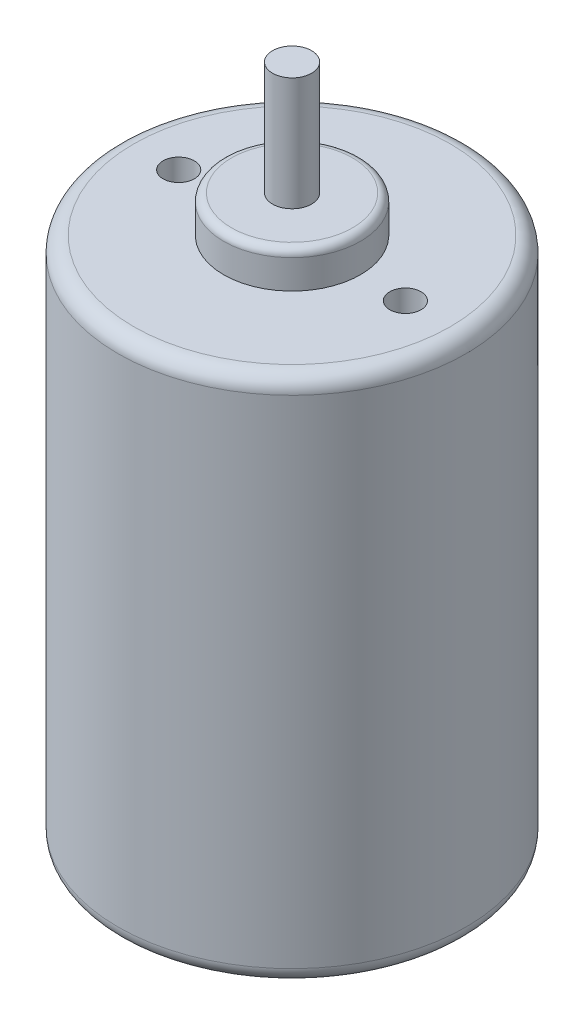
ISO-10303-21;
HEADER;
FILE_DESCRIPTION(('STEP AP214'),'2;1');
FILE_NAME('part.step','',(''),(''),'','','');
FILE_SCHEMA(('AUTOMOTIVE_DESIGN { 1 0 10303 214 1 1 1 1 }'));
ENDSEC;
DATA;
#1=APPLICATION_CONTEXT('core data for automotive mechanical design processes');
#2=APPLICATION_PROTOCOL_DEFINITION('international standard','automotive_design',2000,#1);
#3=PRODUCT_CONTEXT('',#1,'mechanical');
#4=PRODUCT('Part','Part','',(#3));
#5=PRODUCT_RELATED_PRODUCT_CATEGORY('part','',(#4));
#6=PRODUCT_DEFINITION_FORMATION('','',#4);
#7=PRODUCT_DEFINITION_CONTEXT('part definition',#1,'design');
#8=PRODUCT_DEFINITION('design','',#6,#7);
#9=PRODUCT_DEFINITION_SHAPE('','',#8);
#10=(LENGTH_UNIT() NAMED_UNIT(*) SI_UNIT(.MILLI.,.METRE.));
#11=(NAMED_UNIT(*) PLANE_ANGLE_UNIT() SI_UNIT($,.RADIAN.));
#12=(NAMED_UNIT(*) SI_UNIT($,.STERADIAN.) SOLID_ANGLE_UNIT());
#13=UNCERTAINTY_MEASURE_WITH_UNIT(LENGTH_MEASURE(1.E-05),#10,'distance_accuracy_value','');
#14=(GEOMETRIC_REPRESENTATION_CONTEXT(3) GLOBAL_UNCERTAINTY_ASSIGNED_CONTEXT((#13)) GLOBAL_UNIT_ASSIGNED_CONTEXT((#10,
#11,#12)) REPRESENTATION_CONTEXT('',''));
#15=CARTESIAN_POINT('',(0.,0.,0.));
#16=DIRECTION('',(0.,0.,1.));
#17=DIRECTION('',(1.,0.,0.));
#18=AXIS2_PLACEMENT_3D('',#15,#16,#17);
#19=CARTESIAN_POINT('',(0.,67.5,0.));
#20=DIRECTION('',(0.,-1.,0.));
#21=DIRECTION('',(0.,0.,-1.));
#22=AXIS2_PLACEMENT_3D('',#19,#20,#21);
#23=CYLINDRICAL_SURFACE('',#22,22.25);
#24=CARTESIAN_POINT('',(0.,2.,0.));
#25=DIRECTION('',(0.,1.,0.));
#26=DIRECTION('',(0.,0.,1.));
#27=AXIS2_PLACEMENT_3D('',#24,#25,#26);
#28=CIRCLE('',#27,22.25);
#29=CARTESIAN_POINT('',(0.,2.,22.25));
#30=VERTEX_POINT('',#29);
#31=EDGE_CURVE('E64',#30,#30,#28,.T.);
#32=ORIENTED_EDGE('',*,*,#31,.T.);
#33=EDGE_LOOP('',(#32));
#34=FACE_BOUND('',#33,.T.);
#35=CARTESIAN_POINT('',(0.,65.5,0.));
#36=DIRECTION('',(0.,1.,0.));
#37=DIRECTION('',(0.,0.,1.));
#38=AXIS2_PLACEMENT_3D('',#35,#36,#37);
#39=CIRCLE('',#38,22.25);
#40=CARTESIAN_POINT('',(0.,65.5,22.25));
#41=VERTEX_POINT('',#40);
#42=EDGE_CURVE('E68',#41,#41,#39,.F.);
#43=ORIENTED_EDGE('',*,*,#42,.T.);
#44=EDGE_LOOP('',(#43));
#45=FACE_BOUND('',#44,.T.);
#46=ADVANCED_FACE('F40',(#34,#45),#23,.T.);
#47=CARTESIAN_POINT('',(0.,67.5,0.));
#48=DIRECTION('',(0.,1.,0.));
#49=DIRECTION('',(0.,0.,1.));
#50=AXIS2_PLACEMENT_3D('',#47,#48,#49);
#51=PLANE('',#50);
#52=CARTESIAN_POINT('',(0.,67.5,0.));
#53=DIRECTION('',(0.,1.,0.));
#54=DIRECTION('',(0.,0.,1.));
#55=AXIS2_PLACEMENT_3D('',#52,#53,#54);
#56=CIRCLE('',#55,20.25);
#57=CARTESIAN_POINT('',(0.,67.5,20.25));
#58=VERTEX_POINT('',#57);
#59=EDGE_CURVE('E53',#58,#58,#56,.T.);
#60=ORIENTED_EDGE('',*,*,#59,.T.);
#61=EDGE_LOOP('',(#60));
#62=FACE_BOUND('',#61,.T.);
#63=CARTESIAN_POINT('',(14.5,67.5,0.));
#64=DIRECTION('',(0.,1.,0.));
#65=DIRECTION('',(0.,0.,1.));
#66=AXIS2_PLACEMENT_3D('',#63,#64,#65);
#67=CIRCLE('',#66,2.);
#68=CARTESIAN_POINT('',(14.5,67.5,2.));
#69=VERTEX_POINT('',#68);
#70=EDGE_CURVE('E93',#69,#69,#67,.T.);
#71=ORIENTED_EDGE('',*,*,#70,.F.);
#72=EDGE_LOOP('',(#71));
#73=FACE_BOUND('',#72,.T.);
#74=CARTESIAN_POINT('',(-14.5,67.5,0.));
#75=DIRECTION('',(0.,1.,0.));
#76=DIRECTION('',(0.,0.,1.));
#77=AXIS2_PLACEMENT_3D('',#74,#75,#76);
#78=CIRCLE('',#77,2.);
#79=CARTESIAN_POINT('',(-14.5,67.5,2.));
#80=VERTEX_POINT('',#79);
#81=EDGE_CURVE('E89',#80,#80,#78,.T.);
#82=ORIENTED_EDGE('',*,*,#81,.F.);
#83=EDGE_LOOP('',(#82));
#84=FACE_BOUND('',#83,.T.);
#85=CARTESIAN_POINT('',(0.,67.5,0.));
#86=DIRECTION('',(0.,1.,0.));
#87=DIRECTION('',(0.,0.,1.));
#88=AXIS2_PLACEMENT_3D('',#85,#86,#87);
#89=CIRCLE('',#88,8.75);
#90=CARTESIAN_POINT('',(0.,67.5,8.75));
#91=VERTEX_POINT('',#90);
#92=EDGE_CURVE('E73',#91,#91,#89,.T.);
#93=ORIENTED_EDGE('',*,*,#92,.F.);
#94=EDGE_LOOP('',(#93));
#95=FACE_BOUND('',#94,.T.);
#96=ADVANCED_FACE('F110',(#62,#73,#84,#95),#51,.T.);
#97=CARTESIAN_POINT('',(0.,0.,0.));
#98=DIRECTION('',(0.,1.,0.));
#99=DIRECTION('',(0.,0.,1.));
#100=AXIS2_PLACEMENT_3D('',#97,#98,#99);
#101=PLANE('',#100);
#102=CARTESIAN_POINT('',(0.,0.,0.));
#103=DIRECTION('',(0.,1.,0.));
#104=DIRECTION('',(0.,0.,1.));
#105=AXIS2_PLACEMENT_3D('',#102,#103,#104);
#106=CIRCLE('',#105,20.25);
#107=CARTESIAN_POINT('',(0.,0.,20.25));
#108=VERTEX_POINT('',#107);
#109=EDGE_CURVE('E58',#108,#108,#106,.F.);
#110=ORIENTED_EDGE('',*,*,#109,.T.);
#111=EDGE_LOOP('',(#110));
#112=FACE_BOUND('',#111,.T.);
#113=ADVANCED_FACE('F113',(#112),#101,.F.);
#114=CARTESIAN_POINT('',(0.,72.2,0.));
#115=DIRECTION('',(0.,-1.,0.));
#116=DIRECTION('',(0.,0.,-1.));
#117=AXIS2_PLACEMENT_3D('',#114,#115,#116);
#118=CYLINDRICAL_SURFACE('',#117,8.75);
#119=CARTESIAN_POINT('',(0.,71.2,0.));
#120=DIRECTION('',(0.,1.,0.));
#121=DIRECTION('',(0.,0.,1.));
#122=AXIS2_PLACEMENT_3D('',#119,#120,#121);
#123=CIRCLE('',#122,8.75);
#124=CARTESIAN_POINT('',(0.,71.2,8.75));
#125=VERTEX_POINT('',#124);
#126=EDGE_CURVE('E10',#125,#125,#123,.F.);
#127=ORIENTED_EDGE('',*,*,#126,.T.);
#128=EDGE_LOOP('',(#127));
#129=FACE_BOUND('',#128,.T.);
#130=ORIENTED_EDGE('',*,*,#92,.T.);
#131=EDGE_LOOP('',(#130));
#132=FACE_BOUND('',#131,.T.);
#133=ADVANCED_FACE('F120',(#129,#132),#118,.T.);
#134=CARTESIAN_POINT('',(0.,72.2,0.));
#135=DIRECTION('',(0.,1.,0.));
#136=DIRECTION('',(0.,0.,1.));
#137=AXIS2_PLACEMENT_3D('',#134,#135,#136);
#138=PLANE('',#137);
#139=CARTESIAN_POINT('',(0.,72.2,0.));
#140=DIRECTION('',(0.,1.,0.));
#141=DIRECTION('',(0.,0.,1.));
#142=AXIS2_PLACEMENT_3D('',#139,#140,#141);
#143=CIRCLE('',#142,7.75);
#144=CARTESIAN_POINT('',(0.,72.2,7.75));
#145=VERTEX_POINT('',#144);
#146=EDGE_CURVE('E48',#145,#145,#143,.T.);
#147=ORIENTED_EDGE('',*,*,#146,.T.);
#148=EDGE_LOOP('',(#147));
#149=FACE_BOUND('',#148,.T.);
#150=CARTESIAN_POINT('',(0.,72.2,0.));
#151=DIRECTION('',(0.,1.,0.));
#152=DIRECTION('',(0.,0.,1.));
#153=AXIS2_PLACEMENT_3D('',#150,#151,#152);
#154=CIRCLE('',#153,2.5);
#155=CARTESIAN_POINT('',(0.,72.2,-2.5));
#156=VERTEX_POINT('',#155);
#157=EDGE_CURVE('E72',#156,#156,#154,.T.);
#158=ORIENTED_EDGE('',*,*,#157,.F.);
#159=EDGE_LOOP('',(#158));
#160=FACE_BOUND('',#159,.T.);
#161=ADVANCED_FACE('F122',(#149,#160),#138,.T.);
#162=CARTESIAN_POINT('',(0.,86.7,0.));
#163=DIRECTION('',(0.,-1.,0.));
#164=DIRECTION('',(0.,0.,-1.));
#165=AXIS2_PLACEMENT_3D('',#162,#163,#164);
#166=CYLINDRICAL_SURFACE('',#165,2.5);
#167=CARTESIAN_POINT('',(0.,86.7,0.));
#168=DIRECTION('',(0.,1.,0.));
#169=DIRECTION('',(0.,0.,1.));
#170=AXIS2_PLACEMENT_3D('',#167,#168,#169);
#171=CIRCLE('',#170,2.5);
#172=CARTESIAN_POINT('',(0.,86.7,-2.5));
#173=VERTEX_POINT('',#172);
#174=EDGE_CURVE('E77',#173,#173,#171,.T.);
#175=CARTESIAN_POINT('',(0.,86.7,-2.5));
#176=CARTESIAN_POINT('',(0.,86.5489583333333,-2.5));
#177=CARTESIAN_POINT('',(0.,86.3979166666667,-2.5));
#178=CARTESIAN_POINT('',(0.,86.0958333333333,-2.5));
#179=CARTESIAN_POINT('',(0.,85.9447916666667,-2.5));
#180=CARTESIAN_POINT('',(0.,85.6427083333333,-2.5));
#181=CARTESIAN_POINT('',(0.,85.4916666666667,-2.5));
#182=CARTESIAN_POINT('',(0.,85.1895833333333,-2.5));
#183=CARTESIAN_POINT('',(0.,85.0385416666667,-2.5));
#184=CARTESIAN_POINT('',(0.,84.7364583333333,-2.5));
#185=CARTESIAN_POINT('',(0.,84.5854166666667,-2.5));
#186=CARTESIAN_POINT('',(0.,84.2833333333333,-2.5));
#187=CARTESIAN_POINT('',(0.,84.1322916666667,-2.5));
#188=CARTESIAN_POINT('',(0.,83.8302083333333,-2.5));
#189=CARTESIAN_POINT('',(0.,83.6791666666667,-2.5));
#190=CARTESIAN_POINT('',(0.,83.3770833333333,-2.5));
#191=CARTESIAN_POINT('',(0.,83.2260416666667,-2.5));
#192=CARTESIAN_POINT('',(0.,82.9239583333333,-2.5));
#193=CARTESIAN_POINT('',(0.,82.7729166666667,-2.5));
#194=CARTESIAN_POINT('',(0.,82.4708333333333,-2.5));
#195=CARTESIAN_POINT('',(0.,82.3197916666667,-2.5));
#196=CARTESIAN_POINT('',(0.,82.0177083333333,-2.5));
#197=CARTESIAN_POINT('',(0.,81.8666666666667,-2.5));
#198=CARTESIAN_POINT('',(0.,81.5645833333333,-2.5));
#199=CARTESIAN_POINT('',(0.,81.4135416666667,-2.5));
#200=CARTESIAN_POINT('',(0.,81.1114583333333,-2.5));
#201=CARTESIAN_POINT('',(0.,80.9604166666667,-2.5));
#202=CARTESIAN_POINT('',(0.,80.6583333333333,-2.5));
#203=CARTESIAN_POINT('',(0.,80.5072916666667,-2.5));
#204=CARTESIAN_POINT('',(0.,80.2052083333333,-2.5));
#205=CARTESIAN_POINT('',(0.,80.0541666666667,-2.5));
#206=CARTESIAN_POINT('',(0.,79.7520833333333,-2.5));
#207=CARTESIAN_POINT('',(0.,79.6010416666667,-2.5));
#208=CARTESIAN_POINT('',(0.,79.2989583333333,-2.5));
#209=CARTESIAN_POINT('',(0.,79.1479166666667,-2.5));
#210=CARTESIAN_POINT('',(0.,78.8458333333333,-2.5));
#211=CARTESIAN_POINT('',(0.,78.6947916666667,-2.5));
#212=CARTESIAN_POINT('',(0.,78.3927083333333,-2.5));
#213=CARTESIAN_POINT('',(0.,78.2416666666667,-2.5));
#214=CARTESIAN_POINT('',(0.,77.9395833333333,-2.5));
#215=CARTESIAN_POINT('',(0.,77.7885416666667,-2.5));
#216=CARTESIAN_POINT('',(0.,77.4864583333333,-2.5));
#217=CARTESIAN_POINT('',(0.,77.3354166666667,-2.5));
#218=CARTESIAN_POINT('',(0.,77.0333333333333,-2.5));
#219=CARTESIAN_POINT('',(0.,76.8822916666667,-2.5));
#220=CARTESIAN_POINT('',(0.,76.5802083333333,-2.5));
#221=CARTESIAN_POINT('',(0.,76.4291666666667,-2.5));
#222=CARTESIAN_POINT('',(0.,76.1270833333333,-2.5));
#223=CARTESIAN_POINT('',(0.,75.9760416666667,-2.5));
#224=CARTESIAN_POINT('',(0.,75.6739583333333,-2.5));
#225=CARTESIAN_POINT('',(0.,75.5229166666667,-2.5));
#226=CARTESIAN_POINT('',(0.,75.2208333333333,-2.5));
#227=CARTESIAN_POINT('',(0.,75.0697916666667,-2.5));
#228=CARTESIAN_POINT('',(0.,74.7677083333333,-2.5));
#229=CARTESIAN_POINT('',(0.,74.6166666666667,-2.5));
#230=CARTESIAN_POINT('',(0.,74.3145833333333,-2.5));
#231=CARTESIAN_POINT('',(0.,74.1635416666667,-2.5));
#232=CARTESIAN_POINT('',(0.,73.8614583333333,-2.5));
#233=CARTESIAN_POINT('',(0.,73.7104166666667,-2.5));
#234=CARTESIAN_POINT('',(0.,73.4083333333333,-2.5));
#235=CARTESIAN_POINT('',(0.,73.2572916666667,-2.5));
#236=CARTESIAN_POINT('',(0.,72.9552083333333,-2.5));
#237=CARTESIAN_POINT('',(0.,72.8041666666667,-2.5));
#238=CARTESIAN_POINT('',(0.,72.5020833333333,-2.5));
#239=CARTESIAN_POINT('',(0.,72.3510416666667,-2.5));
#240=CARTESIAN_POINT('',(0.,72.2,-2.5));
#241=B_SPLINE_CURVE_WITH_KNOTS('',3,(#175,#176,#177,#178,#179,#180,#181,#182,#183,#184,#185,
#186,#187,#188,#189,#190,#191,#192,#193,#194,#195,#196,#197,#198,#199,#200,#201,#202,#203,#204,
#205,#206,#207,#208,#209,#210,#211,#212,#213,#214,#215,#216,#217,#218,#219,#220,#221,#222,#223,
#224,#225,#226,#227,#228,#229,#230,#231,#232,#233,#234,#235,#236,#237,#238,#239,#240),
.UNSPECIFIED.,.F.,.F.,(4,2,2,2,2,2,2,2,2,2,2,2,2,2,2,2,2,2,2,2,2,2,2,2,2,2,2,2,2,2,2,2,4),(0.,
0.453125000000013,0.906250000000011,1.35937500000001,1.81250000000001,2.26562500000001,
2.71875000000001,3.171875,3.625,4.078125,4.53125,4.984375,5.43750000000001,5.89062500000001,
6.34375000000001,6.79687500000001,7.25000000000001,7.70312500000001,8.15625,8.609375,9.0625,
9.515625,9.96875,10.421875,10.875,11.328125,11.78125,12.234375,12.6875,13.140625,13.59375,
14.046875,14.5),.UNSPECIFIED.);
#242=EDGE_CURVE('BSEAM128',#173,#156,#241,.T.);
#243=ORIENTED_EDGE('',*,*,#174,.F.);
#244=ORIENTED_EDGE('',*,*,#157,.T.);
#245=ORIENTED_EDGE('',*,*,#242,.T.);
#246=ORIENTED_EDGE('',*,*,#242,.F.);
#247=EDGE_LOOP('',(#243,#245,#244,#246));
#248=FACE_BOUND('',#247,.T.);
#249=ADVANCED_FACE('F128',(#248),#166,.T.);
#250=CARTESIAN_POINT('',(0.,86.7,0.));
#251=DIRECTION('',(0.,1.,0.));
#252=DIRECTION('',(0.,0.,1.));
#253=AXIS2_PLACEMENT_3D('',#250,#251,#252);
#254=PLANE('',#253);
#255=ORIENTED_EDGE('',*,*,#174,.T.);
#256=EDGE_LOOP('',(#255));
#257=FACE_BOUND('',#256,.T.);
#258=ADVANCED_FACE('F237',(#257),#254,.T.);
#259=CARTESIAN_POINT('',(-14.5,53.,0.));
#260=DIRECTION('',(0.,1.,0.));
#261=DIRECTION('',(0.,0.,1.));
#262=AXIS2_PLACEMENT_3D('',#259,#260,#261);
#263=CYLINDRICAL_SURFACE('',#262,2.);
#264=CARTESIAN_POINT('',(-14.5,53.,0.));
#265=DIRECTION('',(0.,1.,0.));
#266=DIRECTION('',(0.,0.,1.));
#267=AXIS2_PLACEMENT_3D('',#264,#265,#266);
#268=CIRCLE('',#267,2.);
#269=CARTESIAN_POINT('',(-14.5,53.,2.));
#270=VERTEX_POINT('',#269);
#271=EDGE_CURVE('E85',#270,#270,#268,.T.);
#272=CARTESIAN_POINT('',(-14.5,53.,2.));
#273=CARTESIAN_POINT('',(-14.5,53.1510416666667,2.));
#274=CARTESIAN_POINT('',(-14.5,53.3020833333333,2.));
#275=CARTESIAN_POINT('',(-14.5,53.6041666666667,2.));
#276=CARTESIAN_POINT('',(-14.5,53.7552083333333,2.));
#277=CARTESIAN_POINT('',(-14.5,54.0572916666667,2.));
#278=CARTESIAN_POINT('',(-14.5,54.2083333333333,2.));
#279=CARTESIAN_POINT('',(-14.5,54.5104166666667,2.));
#280=CARTESIAN_POINT('',(-14.5,54.6614583333333,2.));
#281=CARTESIAN_POINT('',(-14.5,54.9635416666667,2.));
#282=CARTESIAN_POINT('',(-14.5,55.1145833333333,2.));
#283=CARTESIAN_POINT('',(-14.5,55.4166666666667,2.));
#284=CARTESIAN_POINT('',(-14.5,55.5677083333333,2.));
#285=CARTESIAN_POINT('',(-14.5,55.8697916666667,2.));
#286=CARTESIAN_POINT('',(-14.5,56.0208333333333,2.));
#287=CARTESIAN_POINT('',(-14.5,56.3229166666667,2.));
#288=CARTESIAN_POINT('',(-14.5,56.4739583333333,2.));
#289=CARTESIAN_POINT('',(-14.5,56.7760416666667,2.));
#290=CARTESIAN_POINT('',(-14.5,56.9270833333333,2.));
#291=CARTESIAN_POINT('',(-14.5,57.2291666666667,2.));
#292=CARTESIAN_POINT('',(-14.5,57.3802083333333,2.));
#293=CARTESIAN_POINT('',(-14.5,57.6822916666667,2.));
#294=CARTESIAN_POINT('',(-14.5,57.8333333333333,2.));
#295=CARTESIAN_POINT('',(-14.5,58.1354166666667,2.));
#296=CARTESIAN_POINT('',(-14.5,58.2864583333333,2.));
#297=CARTESIAN_POINT('',(-14.5,58.5885416666667,2.));
#298=CARTESIAN_POINT('',(-14.5,58.7395833333333,2.));
#299=CARTESIAN_POINT('',(-14.5,59.0416666666667,2.));
#300=CARTESIAN_POINT('',(-14.5,59.1927083333333,2.));
#301=CARTESIAN_POINT('',(-14.5,59.4947916666667,2.));
#302=CARTESIAN_POINT('',(-14.5,59.6458333333333,2.));
#303=CARTESIAN_POINT('',(-14.5,59.9479166666667,2.));
#304=CARTESIAN_POINT('',(-14.5,60.0989583333333,2.));
#305=CARTESIAN_POINT('',(-14.5,60.4010416666667,2.));
#306=CARTESIAN_POINT('',(-14.5,60.5520833333333,2.));
#307=CARTESIAN_POINT('',(-14.5,60.8541666666667,2.));
#308=CARTESIAN_POINT('',(-14.5,61.0052083333333,2.));
#309=CARTESIAN_POINT('',(-14.5,61.3072916666667,2.));
#310=CARTESIAN_POINT('',(-14.5,61.4583333333333,2.));
#311=CARTESIAN_POINT('',(-14.5,61.7604166666667,2.));
#312=CARTESIAN_POINT('',(-14.5,61.9114583333333,2.));
#313=CARTESIAN_POINT('',(-14.5,62.2135416666667,2.));
#314=CARTESIAN_POINT('',(-14.5,62.3645833333333,2.));
#315=CARTESIAN_POINT('',(-14.5,62.6666666666667,2.));
#316=CARTESIAN_POINT('',(-14.5,62.8177083333333,2.));
#317=CARTESIAN_POINT('',(-14.5,63.1197916666667,2.));
#318=CARTESIAN_POINT('',(-14.5,63.2708333333333,2.));
#319=CARTESIAN_POINT('',(-14.5,63.5729166666667,2.));
#320=CARTESIAN_POINT('',(-14.5,63.7239583333333,2.));
#321=CARTESIAN_POINT('',(-14.5,64.0260416666667,2.));
#322=CARTESIAN_POINT('',(-14.5,64.1770833333333,2.));
#323=CARTESIAN_POINT('',(-14.5,64.4791666666667,2.));
#324=CARTESIAN_POINT('',(-14.5,64.6302083333333,2.));
#325=CARTESIAN_POINT('',(-14.5,64.9322916666667,2.));
#326=CARTESIAN_POINT('',(-14.5,65.0833333333333,2.));
#327=CARTESIAN_POINT('',(-14.5,65.3854166666667,2.));
#328=CARTESIAN_POINT('',(-14.5,65.5364583333333,2.));
#329=CARTESIAN_POINT('',(-14.5,65.8385416666667,2.));
#330=CARTESIAN_POINT('',(-14.5,65.9895833333333,2.));
#331=CARTESIAN_POINT('',(-14.5,66.2916666666667,2.));
#332=CARTESIAN_POINT('',(-14.5,66.4427083333333,2.));
#333=CARTESIAN_POINT('',(-14.5,66.7447916666667,2.));
#334=CARTESIAN_POINT('',(-14.5,66.8958333333333,2.));
#335=CARTESIAN_POINT('',(-14.5,67.1979166666667,2.));
#336=CARTESIAN_POINT('',(-14.5,67.3489583333333,2.));
#337=CARTESIAN_POINT('',(-14.5,67.5,2.));
#338=B_SPLINE_CURVE_WITH_KNOTS('',3,(#272,#273,#274,#275,#276,#277,#278,#279,#280,#281,#282,
#283,#284,#285,#286,#287,#288,#289,#290,#291,#292,#293,#294,#295,#296,#297,#298,#299,#300,#301,
#302,#303,#304,#305,#306,#307,#308,#309,#310,#311,#312,#313,#314,#315,#316,#317,#318,#319,#320,
#321,#322,#323,#324,#325,#326,#327,#328,#329,#330,#331,#332,#333,#334,#335,#336,#337),
.UNSPECIFIED.,.F.,.F.,(4,2,2,2,2,2,2,2,2,2,2,2,2,2,2,2,2,2,2,2,2,2,2,2,2,2,2,2,2,2,2,2,4),(0.,
0.453124999999999,0.906249999999997,1.359375,1.81249999999999,2.26562499999999,2.71874999999999,
3.171875,3.625,4.07812499999999,4.53124999999999,4.98437499999999,5.43749999999999,5.890625,
6.34375,6.79687499999999,7.24999999999999,7.70312499999999,8.15624999999999,8.60937499999999,
9.06249999999999,9.51562499999999,9.96874999999998,10.421875,10.875,11.328125,11.78125,
12.234375,12.6875,13.140625,13.59375,14.046875,14.5),.UNSPECIFIED.);
#339=EDGE_CURVE('BSEAM226',#270,#80,#338,.T.);
#340=ORIENTED_EDGE('',*,*,#271,.F.);
#341=ORIENTED_EDGE('',*,*,#81,.T.);
#342=ORIENTED_EDGE('',*,*,#339,.T.);
#343=ORIENTED_EDGE('',*,*,#339,.F.);
#344=EDGE_LOOP('',(#340,#342,#341,#343));
#345=FACE_BOUND('',#344,.T.);
#346=ADVANCED_FACE('F226',(#345),#263,.F.);
#347=CARTESIAN_POINT('',(-14.5,53.,0.));
#348=DIRECTION('',(0.,1.,0.));
#349=DIRECTION('',(0.,0.,1.));
#350=AXIS2_PLACEMENT_3D('',#347,#348,#349);
#351=PLANE('',#350);
#352=ORIENTED_EDGE('',*,*,#271,.T.);
#353=EDGE_LOOP('',(#352));
#354=FACE_BOUND('',#353,.T.);
#355=ADVANCED_FACE('F106',(#354),#351,.T.);
#356=CARTESIAN_POINT('',(14.5,53.,0.));
#357=DIRECTION('',(0.,1.,0.));
#358=DIRECTION('',(0.,0.,1.));
#359=AXIS2_PLACEMENT_3D('',#356,#357,#358);
#360=CYLINDRICAL_SURFACE('',#359,2.);
#361=CARTESIAN_POINT('',(14.5,53.,0.));
#362=DIRECTION('',(0.,1.,0.));
#363=DIRECTION('',(0.,0.,1.));
#364=AXIS2_PLACEMENT_3D('',#361,#362,#363);
#365=CIRCLE('',#364,2.);
#366=CARTESIAN_POINT('',(14.5,53.,2.));
#367=VERTEX_POINT('',#366);
#368=EDGE_CURVE('E84',#367,#367,#365,.T.);
#369=CARTESIAN_POINT('',(14.5,53.,2.));
#370=CARTESIAN_POINT('',(14.5,53.1510416666667,2.));
#371=CARTESIAN_POINT('',(14.5,53.3020833333333,2.));
#372=CARTESIAN_POINT('',(14.5,53.6041666666667,2.));
#373=CARTESIAN_POINT('',(14.5,53.7552083333333,2.));
#374=CARTESIAN_POINT('',(14.5,54.0572916666667,2.));
#375=CARTESIAN_POINT('',(14.5,54.2083333333333,2.));
#376=CARTESIAN_POINT('',(14.5,54.5104166666667,2.));
#377=CARTESIAN_POINT('',(14.5,54.6614583333333,2.));
#378=CARTESIAN_POINT('',(14.5,54.9635416666667,2.));
#379=CARTESIAN_POINT('',(14.5,55.1145833333333,2.));
#380=CARTESIAN_POINT('',(14.5,55.4166666666667,2.));
#381=CARTESIAN_POINT('',(14.5,55.5677083333333,2.));
#382=CARTESIAN_POINT('',(14.5,55.8697916666667,2.));
#383=CARTESIAN_POINT('',(14.5,56.0208333333333,2.));
#384=CARTESIAN_POINT('',(14.5,56.3229166666667,2.));
#385=CARTESIAN_POINT('',(14.5,56.4739583333333,2.));
#386=CARTESIAN_POINT('',(14.5,56.7760416666667,2.));
#387=CARTESIAN_POINT('',(14.5,56.9270833333333,2.));
#388=CARTESIAN_POINT('',(14.5,57.2291666666667,2.));
#389=CARTESIAN_POINT('',(14.5,57.3802083333333,2.));
#390=CARTESIAN_POINT('',(14.5,57.6822916666667,2.));
#391=CARTESIAN_POINT('',(14.5,57.8333333333333,2.));
#392=CARTESIAN_POINT('',(14.5,58.1354166666667,2.));
#393=CARTESIAN_POINT('',(14.5,58.2864583333333,2.));
#394=CARTESIAN_POINT('',(14.5,58.5885416666667,2.));
#395=CARTESIAN_POINT('',(14.5,58.7395833333333,2.));
#396=CARTESIAN_POINT('',(14.5,59.0416666666667,2.));
#397=CARTESIAN_POINT('',(14.5,59.1927083333333,2.));
#398=CARTESIAN_POINT('',(14.5,59.4947916666667,2.));
#399=CARTESIAN_POINT('',(14.5,59.6458333333333,2.));
#400=CARTESIAN_POINT('',(14.5,59.9479166666667,2.));
#401=CARTESIAN_POINT('',(14.5,60.0989583333333,2.));
#402=CARTESIAN_POINT('',(14.5,60.4010416666667,2.));
#403=CARTESIAN_POINT('',(14.5,60.5520833333333,2.));
#404=CARTESIAN_POINT('',(14.5,60.8541666666667,2.));
#405=CARTESIAN_POINT('',(14.5,61.0052083333333,2.));
#406=CARTESIAN_POINT('',(14.5,61.3072916666667,2.));
#407=CARTESIAN_POINT('',(14.5,61.4583333333333,2.));
#408=CARTESIAN_POINT('',(14.5,61.7604166666667,2.));
#409=CARTESIAN_POINT('',(14.5,61.9114583333333,2.));
#410=CARTESIAN_POINT('',(14.5,62.2135416666667,2.));
#411=CARTESIAN_POINT('',(14.5,62.3645833333333,2.));
#412=CARTESIAN_POINT('',(14.5,62.6666666666667,2.));
#413=CARTESIAN_POINT('',(14.5,62.8177083333333,2.));
#414=CARTESIAN_POINT('',(14.5,63.1197916666667,2.));
#415=CARTESIAN_POINT('',(14.5,63.2708333333333,2.));
#416=CARTESIAN_POINT('',(14.5,63.5729166666667,2.));
#417=CARTESIAN_POINT('',(14.5,63.7239583333333,2.));
#418=CARTESIAN_POINT('',(14.5,64.0260416666667,2.));
#419=CARTESIAN_POINT('',(14.5,64.1770833333333,2.));
#420=CARTESIAN_POINT('',(14.5,64.4791666666667,2.));
#421=CARTESIAN_POINT('',(14.5,64.6302083333333,2.));
#422=CARTESIAN_POINT('',(14.5,64.9322916666667,2.));
#423=CARTESIAN_POINT('',(14.5,65.0833333333333,2.));
#424=CARTESIAN_POINT('',(14.5,65.3854166666667,2.));
#425=CARTESIAN_POINT('',(14.5,65.5364583333333,2.));
#426=CARTESIAN_POINT('',(14.5,65.8385416666667,2.));
#427=CARTESIAN_POINT('',(14.5,65.9895833333333,2.));
#428=CARTESIAN_POINT('',(14.5,66.2916666666667,2.));
#429=CARTESIAN_POINT('',(14.5,66.4427083333333,2.));
#430=CARTESIAN_POINT('',(14.5,66.7447916666667,2.));
#431=CARTESIAN_POINT('',(14.5,66.8958333333333,2.));
#432=CARTESIAN_POINT('',(14.5,67.1979166666667,2.));
#433=CARTESIAN_POINT('',(14.5,67.3489583333333,2.));
#434=CARTESIAN_POINT('',(14.5,67.5,2.));
#435=B_SPLINE_CURVE_WITH_KNOTS('',3,(#369,#370,#371,#372,#373,#374,#375,#376,#377,#378,#379,
#380,#381,#382,#383,#384,#385,#386,#387,#388,#389,#390,#391,#392,#393,#394,#395,#396,#397,#398,
#399,#400,#401,#402,#403,#404,#405,#406,#407,#408,#409,#410,#411,#412,#413,#414,#415,#416,#417,
#418,#419,#420,#421,#422,#423,#424,#425,#426,#427,#428,#429,#430,#431,#432,#433,#434),
.UNSPECIFIED.,.F.,.F.,(4,2,2,2,2,2,2,2,2,2,2,2,2,2,2,2,2,2,2,2,2,2,2,2,2,2,2,2,2,2,2,2,4),(0.,
0.453124999999999,0.906249999999997,1.359375,1.81249999999999,2.26562499999999,2.71874999999999,
3.171875,3.625,4.07812499999999,4.53124999999999,4.98437499999999,5.43749999999999,5.890625,
6.34375,6.79687499999999,7.24999999999999,7.70312499999999,8.15624999999999,8.60937499999999,
9.06249999999999,9.51562499999999,9.96874999999998,10.421875,10.875,11.328125,11.78125,
12.234375,12.6875,13.140625,13.59375,14.046875,14.5),.UNSPECIFIED.);
#436=EDGE_CURVE('BSEAM103',#367,#69,#435,.T.);
#437=ORIENTED_EDGE('',*,*,#368,.F.);
#438=ORIENTED_EDGE('',*,*,#70,.T.);
#439=ORIENTED_EDGE('',*,*,#436,.T.);
#440=ORIENTED_EDGE('',*,*,#436,.F.);
#441=EDGE_LOOP('',(#437,#439,#438,#440));
#442=FACE_BOUND('',#441,.T.);
#443=ADVANCED_FACE('F103',(#442),#360,.F.);
#444=CARTESIAN_POINT('',(14.5,53.,0.));
#445=DIRECTION('',(0.,1.,0.));
#446=DIRECTION('',(0.,0.,1.));
#447=AXIS2_PLACEMENT_3D('',#444,#445,#446);
#448=PLANE('',#447);
#449=ORIENTED_EDGE('',*,*,#368,.T.);
#450=EDGE_LOOP('',(#449));
#451=FACE_BOUND('',#450,.T.);
#452=ADVANCED_FACE('F101',(#451),#448,.T.);
#453=CARTESIAN_POINT('',(0.,2.,0.));
#454=DIRECTION('',(0.,1.,0.));
#455=DIRECTION('',(0.,0.,1.));
#456=AXIS2_PLACEMENT_3D('',#453,#454,#455);
#457=TOROIDAL_SURFACE('',#456,20.25,2.);
#458=ORIENTED_EDGE('',*,*,#109,.F.);
#459=EDGE_LOOP('',(#458));
#460=FACE_BOUND('',#459,.T.);
#461=ORIENTED_EDGE('',*,*,#31,.F.);
#462=EDGE_LOOP('',(#461));
#463=FACE_BOUND('',#462,.T.);
#464=ADVANCED_FACE('F139',(#460,#463),#457,.T.);
#465=CARTESIAN_POINT('',(0.,65.5,0.));
#466=DIRECTION('',(0.,1.,0.));
#467=DIRECTION('',(0.,0.,1.));
#468=AXIS2_PLACEMENT_3D('',#465,#466,#467);
#469=TOROIDAL_SURFACE('',#468,20.25,2.);
#470=ORIENTED_EDGE('',*,*,#42,.F.);
#471=EDGE_LOOP('',(#470));
#472=FACE_BOUND('',#471,.T.);
#473=ORIENTED_EDGE('',*,*,#59,.F.);
#474=EDGE_LOOP('',(#473));
#475=FACE_BOUND('',#474,.T.);
#476=ADVANCED_FACE('F141',(#472,#475),#469,.T.);
#477=CARTESIAN_POINT('',(0.,71.2,0.));
#478=DIRECTION('',(0.,1.,0.));
#479=DIRECTION('',(0.,0.,1.));
#480=AXIS2_PLACEMENT_3D('',#477,#478,#479);
#481=TOROIDAL_SURFACE('',#480,7.75,1.);
#482=ORIENTED_EDGE('',*,*,#126,.F.);
#483=EDGE_LOOP('',(#482));
#484=FACE_BOUND('',#483,.T.);
#485=ORIENTED_EDGE('',*,*,#146,.F.);
#486=EDGE_LOOP('',(#485));
#487=FACE_BOUND('',#486,.T.);
#488=ADVANCED_FACE('F42',(#484,#487),#481,.T.);
#489=CLOSED_SHELL('',(#46,#96,#113,#133,#161,#249,#258,#346,#355,#443,#452,#464,#476,#488));
#490=MANIFOLD_SOLID_BREP('B2',#489);
#491=ADVANCED_BREP_SHAPE_REPRESENTATION('',(#18,#490),#14);
#492=SHAPE_DEFINITION_REPRESENTATION(#9,#491);
ENDSEC;
END-ISO-10303-21;
